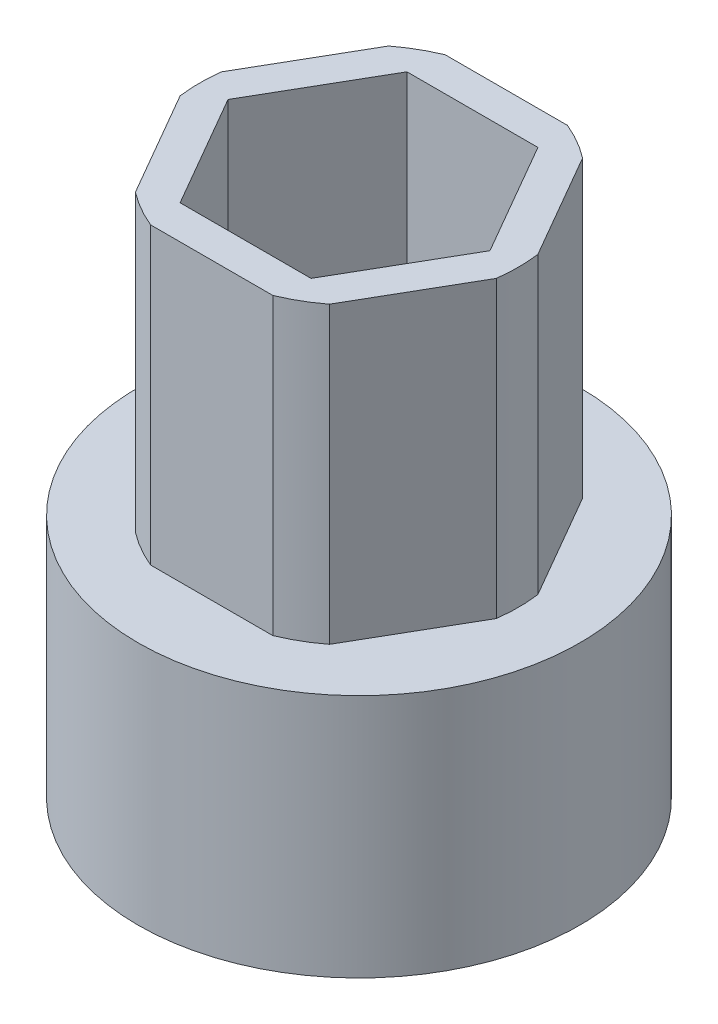
ISO-10303-21;
HEADER;
FILE_DESCRIPTION(('STEP AP214'),'2;1');
FILE_NAME('part.step','',(''),(''),'','','');
FILE_SCHEMA(('AUTOMOTIVE_DESIGN { 1 0 10303 214 1 1 1 1 }'));
ENDSEC;
DATA;
#1=APPLICATION_CONTEXT('core data for automotive mechanical design processes');
#2=APPLICATION_PROTOCOL_DEFINITION('international standard','automotive_design',2000,#1);
#3=PRODUCT_CONTEXT('',#1,'mechanical');
#4=PRODUCT('Part','Part','',(#3));
#5=PRODUCT_RELATED_PRODUCT_CATEGORY('part','',(#4));
#6=PRODUCT_DEFINITION_FORMATION('','',#4);
#7=PRODUCT_DEFINITION_CONTEXT('part definition',#1,'design');
#8=PRODUCT_DEFINITION('design','',#6,#7);
#9=PRODUCT_DEFINITION_SHAPE('','',#8);
#10=(LENGTH_UNIT() NAMED_UNIT(*) SI_UNIT(.MILLI.,.METRE.));
#11=(NAMED_UNIT(*) PLANE_ANGLE_UNIT() SI_UNIT($,.RADIAN.));
#12=(NAMED_UNIT(*) SI_UNIT($,.STERADIAN.) SOLID_ANGLE_UNIT());
#13=UNCERTAINTY_MEASURE_WITH_UNIT(LENGTH_MEASURE(1.E-05),#10,'distance_accuracy_value','');
#14=(GEOMETRIC_REPRESENTATION_CONTEXT(3) GLOBAL_UNCERTAINTY_ASSIGNED_CONTEXT((#13)) GLOBAL_UNIT_ASSIGNED_CONTEXT((#10,
#11,#12)) REPRESENTATION_CONTEXT('',''));
#15=CARTESIAN_POINT('',(0.,0.,0.));
#16=DIRECTION('',(0.,0.,1.));
#17=DIRECTION('',(1.,0.,0.));
#18=AXIS2_PLACEMENT_3D('',#15,#16,#17);
#19=CARTESIAN_POINT('',(0.,10.541,0.));
#20=DIRECTION('',(0.,1.,0.));
#21=DIRECTION('',(0.,0.,1.));
#22=AXIS2_PLACEMENT_3D('',#19,#20,#21);
#23=PLANE('',#22);
#24=CARTESIAN_POINT('',(0.,10.541,0.));
#25=DIRECTION('',(0.,1.,0.));
#26=DIRECTION('',(0.,0.,1.));
#27=AXIS2_PLACEMENT_3D('',#24,#25,#26);
#28=CIRCLE('',#27,6.875);
#29=CARTESIAN_POINT('',(6.81675182633099,10.541,0.893039494206789));
#30=VERTEX_POINT('',#29);
#31=CARTESIAN_POINT('',(6.81675182633099,10.541,-0.893039494206791));
#32=VERTEX_POINT('',#31);
#33=EDGE_CURVE('E233',#30,#32,#28,.T.);
#34=ORIENTED_EDGE('',*,*,#33,.F.);
#35=DIRECTION('',(0.5,0.,-0.866025403784439));
#36=VECTOR('',#35,1.);
#37=CARTESIAN_POINT('',(5.49926131403119,10.541,3.175));
#38=LINE('',#37,#36);
#39=CARTESIAN_POINT('',(4.18177080173138,10.541,5.45696050579321));
#40=VERTEX_POINT('',#39);
#41=EDGE_CURVE('E230',#40,#30,#38,.T.);
#42=ORIENTED_EDGE('',*,*,#41,.F.);
#43=CARTESIAN_POINT('',(0.,10.541,0.));
#44=DIRECTION('',(0.,1.,0.));
#45=DIRECTION('',(0.,0.,1.));
#46=AXIS2_PLACEMENT_3D('',#43,#44,#45);
#47=CIRCLE('',#46,6.875);
#48=CARTESIAN_POINT('',(2.6349810245996,10.541,6.35));
#49=VERTEX_POINT('',#48);
#50=EDGE_CURVE('E192',#49,#40,#47,.T.);
#51=ORIENTED_EDGE('',*,*,#50,.F.);
#52=DIRECTION('',(1.,0.,0.));
#53=VECTOR('',#52,1.);
#54=CARTESIAN_POINT('',(0.,10.541,6.35));
#55=LINE('',#54,#53);
#56=CARTESIAN_POINT('',(-2.6349810245996,10.541,6.35));
#57=VERTEX_POINT('',#56);
#58=EDGE_CURVE('E194',#57,#49,#55,.T.);
#59=ORIENTED_EDGE('',*,*,#58,.F.);
#60=CARTESIAN_POINT('',(0.,10.541,0.));
#61=DIRECTION('',(0.,1.,0.));
#62=DIRECTION('',(0.,0.,1.));
#63=AXIS2_PLACEMENT_3D('',#60,#61,#62);
#64=CIRCLE('',#63,6.875);
#65=CARTESIAN_POINT('',(-4.18177080173139,10.541,5.4569605057932));
#66=VERTEX_POINT('',#65);
#67=EDGE_CURVE('E249',#66,#57,#64,.T.);
#68=ORIENTED_EDGE('',*,*,#67,.F.);
#69=DIRECTION('',(0.500000000000001,0.,0.866025403784438));
#70=VECTOR('',#69,1.);
#71=CARTESIAN_POINT('',(-5.49926131403119,10.541,3.17500000000001));
#72=LINE('',#71,#70);
#73=CARTESIAN_POINT('',(-6.81675182633099,10.541,0.893039494206804));
#74=VERTEX_POINT('',#73);
#75=EDGE_CURVE('E247',#74,#66,#72,.T.);
#76=ORIENTED_EDGE('',*,*,#75,.F.);
#77=CARTESIAN_POINT('',(0.,10.541,0.));
#78=DIRECTION('',(0.,1.,0.));
#79=DIRECTION('',(0.,0.,1.));
#80=AXIS2_PLACEMENT_3D('',#77,#78,#79);
#81=CIRCLE('',#80,6.875);
#82=CARTESIAN_POINT('',(-6.81675182633099,10.541,-0.893039494206801));
#83=VERTEX_POINT('',#82);
#84=EDGE_CURVE('E245',#83,#74,#81,.T.);
#85=ORIENTED_EDGE('',*,*,#84,.F.);
#86=DIRECTION('',(-0.5,0.,0.866025403784439));
#87=VECTOR('',#86,1.);
#88=CARTESIAN_POINT('',(-5.49926131403119,10.541,-3.175));
#89=LINE('',#88,#87);
#90=CARTESIAN_POINT('',(-4.18177080173139,10.541,-5.4569605057932));
#91=VERTEX_POINT('',#90);
#92=EDGE_CURVE('E243',#91,#83,#89,.T.);
#93=ORIENTED_EDGE('',*,*,#92,.F.);
#94=CARTESIAN_POINT('',(0.,10.541,0.));
#95=DIRECTION('',(0.,1.,0.));
#96=DIRECTION('',(0.,0.,1.));
#97=AXIS2_PLACEMENT_3D('',#94,#95,#96);
#98=CIRCLE('',#97,6.875);
#99=CARTESIAN_POINT('',(-2.6349810245996,10.541,-6.35));
#100=VERTEX_POINT('',#99);
#101=EDGE_CURVE('E241',#100,#91,#98,.T.);
#102=ORIENTED_EDGE('',*,*,#101,.F.);
#103=DIRECTION('',(-1.,0.,0.));
#104=VECTOR('',#103,1.);
#105=CARTESIAN_POINT('',(0.,10.541,-6.35));
#106=LINE('',#105,#104);
#107=CARTESIAN_POINT('',(2.6349810245996,10.541,-6.35));
#108=VERTEX_POINT('',#107);
#109=EDGE_CURVE('E239',#108,#100,#106,.T.);
#110=ORIENTED_EDGE('',*,*,#109,.F.);
#111=CARTESIAN_POINT('',(0.,10.541,0.));
#112=DIRECTION('',(0.,1.,0.));
#113=DIRECTION('',(0.,0.,1.));
#114=AXIS2_PLACEMENT_3D('',#111,#112,#113);
#115=CIRCLE('',#114,6.875);
#116=CARTESIAN_POINT('',(4.18177080173138,10.541,-5.45696050579321));
#117=VERTEX_POINT('',#116);
#118=EDGE_CURVE('E237',#117,#108,#115,.T.);
#119=ORIENTED_EDGE('',*,*,#118,.F.);
#120=DIRECTION('',(-0.5,0.,-0.866025403784439));
#121=VECTOR('',#120,1.);
#122=CARTESIAN_POINT('',(5.49926131403118,10.541,-3.175));
#123=LINE('',#122,#121);
#124=EDGE_CURVE('E235',#32,#117,#123,.T.);
#125=ORIENTED_EDGE('',*,*,#124,.F.);
#126=EDGE_LOOP('',(#34,#42,#51,#59,#68,#76,#85,#93,#102,#110,#119,#125));
#127=FACE_BOUND('',#126,.T.);
#128=CARTESIAN_POINT('',(0.,10.541,0.));
#129=DIRECTION('',(0.,1.,0.));
#130=DIRECTION('',(0.,0.,1.));
#131=AXIS2_PLACEMENT_3D('',#128,#129,#130);
#132=CIRCLE('',#131,9.525);
#133=CARTESIAN_POINT('',(0.,10.541,9.525));
#134=VERTEX_POINT('',#133);
#135=EDGE_CURVE('E11',#134,#134,#132,.T.);
#136=ORIENTED_EDGE('',*,*,#135,.T.);
#137=EDGE_LOOP('',(#136));
#138=FACE_BOUND('',#137,.T.);
#139=ADVANCED_FACE('F39',(#127,#138),#23,.T.);
#140=CARTESIAN_POINT('',(0.,0.,0.));
#141=DIRECTION('',(0.,1.,0.));
#142=DIRECTION('',(0.,0.,1.));
#143=AXIS2_PLACEMENT_3D('',#140,#141,#142);
#144=PLANE('',#143);
#145=CARTESIAN_POINT('',(0.,0.,0.));
#146=DIRECTION('',(0.,1.,0.));
#147=DIRECTION('',(0.,0.,1.));
#148=AXIS2_PLACEMENT_3D('',#145,#146,#147);
#149=CIRCLE('',#148,9.525);
#150=CARTESIAN_POINT('',(0.,0.,9.525));
#151=VERTEX_POINT('',#150);
#152=EDGE_CURVE('E43',#151,#151,#149,.T.);
#153=ORIENTED_EDGE('',*,*,#152,.F.);
#154=EDGE_LOOP('',(#153));
#155=FACE_BOUND('',#154,.T.);
#156=DIRECTION('',(0.5,0.,-0.866025403784439));
#157=VECTOR('',#156,1.);
#158=CARTESIAN_POINT('',(2.82295414120267,0.,4.8895));
#159=LINE('',#158,#157);
#160=CARTESIAN_POINT('',(2.82295414120267,0.,4.8895));
#161=VERTEX_POINT('',#160);
#162=CARTESIAN_POINT('',(5.64590828240535,0.,0.));
#163=VERTEX_POINT('',#162);
#164=EDGE_CURVE('E62',#161,#163,#159,.T.);
#165=ORIENTED_EDGE('',*,*,#164,.T.);
#166=DIRECTION('',(-0.5,0.,-0.866025403784439));
#167=VECTOR('',#166,1.);
#168=CARTESIAN_POINT('',(5.64590828240535,0.,0.));
#169=LINE('',#168,#167);
#170=CARTESIAN_POINT('',(2.82295414120267,0.,-4.8895));
#171=VERTEX_POINT('',#170);
#172=EDGE_CURVE('E285',#163,#171,#169,.T.);
#173=ORIENTED_EDGE('',*,*,#172,.T.);
#174=DIRECTION('',(-1.,0.,0.));
#175=VECTOR('',#174,1.);
#176=CARTESIAN_POINT('',(2.82295414120267,0.,-4.8895));
#177=LINE('',#176,#175);
#178=CARTESIAN_POINT('',(-2.82295414120268,0.,-4.8895));
#179=VERTEX_POINT('',#178);
#180=EDGE_CURVE('E172',#171,#179,#177,.T.);
#181=ORIENTED_EDGE('',*,*,#180,.T.);
#182=DIRECTION('',(-0.5,0.,0.866025403784439));
#183=VECTOR('',#182,1.);
#184=CARTESIAN_POINT('',(-2.82295414120268,0.,-4.8895));
#185=LINE('',#184,#183);
#186=CARTESIAN_POINT('',(-5.64590828240535,0.,0.));
#187=VERTEX_POINT('',#186);
#188=EDGE_CURVE('E288',#179,#187,#185,.T.);
#189=ORIENTED_EDGE('',*,*,#188,.T.);
#190=DIRECTION('',(0.5,0.,0.866025403784439));
#191=VECTOR('',#190,1.);
#192=CARTESIAN_POINT('',(-5.64590828240535,0.,0.));
#193=LINE('',#192,#191);
#194=CARTESIAN_POINT('',(-2.82295414120268,0.,4.8895));
#195=VERTEX_POINT('',#194);
#196=EDGE_CURVE('E291',#187,#195,#193,.T.);
#197=ORIENTED_EDGE('',*,*,#196,.T.);
#198=DIRECTION('',(1.,0.,0.));
#199=VECTOR('',#198,1.);
#200=CARTESIAN_POINT('',(-2.82295414120268,0.,4.8895));
#201=LINE('',#200,#199);
#202=EDGE_CURVE('E294',#195,#161,#201,.T.);
#203=ORIENTED_EDGE('',*,*,#202,.T.);
#204=EDGE_LOOP('',(#165,#173,#181,#189,#197,#203));
#205=FACE_BOUND('',#204,.T.);
#206=ADVANCED_FACE('F308',(#155,#205),#144,.F.);
#207=CARTESIAN_POINT('',(0.,10.541,0.));
#208=DIRECTION('',(0.,-1.,0.));
#209=DIRECTION('',(0.,0.,-1.));
#210=AXIS2_PLACEMENT_3D('',#207,#208,#209);
#211=CYLINDRICAL_SURFACE('',#210,9.525);
#212=ORIENTED_EDGE('',*,*,#135,.F.);
#213=EDGE_LOOP('',(#212));
#214=FACE_BOUND('',#213,.T.);
#215=ORIENTED_EDGE('',*,*,#152,.T.);
#216=EDGE_LOOP('',(#215));
#217=FACE_BOUND('',#216,.T.);
#218=ADVANCED_FACE('F41',(#214,#217),#211,.T.);
#219=CARTESIAN_POINT('',(2.82295414120267,10.541,4.8895));
#220=DIRECTION('',(-0.866025403784439,0.,-0.5));
#221=DIRECTION('',(-0.5,0.,0.866025403784439));
#222=AXIS2_PLACEMENT_3D('',#219,#220,#221);
#223=PLANE('',#222);
#224=ORIENTED_EDGE('',*,*,#164,.F.);
#225=DIRECTION('',(0.,-1.,0.));
#226=VECTOR('',#225,1.);
#227=CARTESIAN_POINT('',(2.82295414120267,10.541,4.8895));
#228=LINE('',#227,#226);
#229=CARTESIAN_POINT('',(2.82295414120267,23.241,4.8895));
#230=VERTEX_POINT('',#229);
#231=EDGE_CURVE('E297',#230,#161,#228,.T.);
#232=ORIENTED_EDGE('',*,*,#231,.F.);
#233=DIRECTION('',(-0.5,0.,0.866025403784439));
#234=VECTOR('',#233,1.);
#235=CARTESIAN_POINT('',(4.23443121180401,23.241,2.44475));
#236=LINE('',#235,#234);
#237=CARTESIAN_POINT('',(5.64590828240535,23.241,0.));
#238=VERTEX_POINT('',#237);
#239=EDGE_CURVE('E184',#238,#230,#236,.T.);
#240=ORIENTED_EDGE('',*,*,#239,.F.);
#241=DIRECTION('',(0.,-1.,0.));
#242=VECTOR('',#241,1.);
#243=CARTESIAN_POINT('',(5.64590828240535,10.541,0.));
#244=LINE('',#243,#242);
#245=EDGE_CURVE('E175',#238,#163,#244,.T.);
#246=ORIENTED_EDGE('',*,*,#245,.T.);
#247=EDGE_LOOP('',(#224,#232,#240,#246));
#248=FACE_BOUND('',#247,.T.);
#249=ADVANCED_FACE('F316',(#248),#223,.T.);
#250=CARTESIAN_POINT('',(5.64590828240535,10.541,0.));
#251=DIRECTION('',(-0.866025403784439,0.,0.5));
#252=DIRECTION('',(0.5,0.,0.866025403784439));
#253=AXIS2_PLACEMENT_3D('',#250,#251,#252);
#254=PLANE('',#253);
#255=ORIENTED_EDGE('',*,*,#172,.F.);
#256=ORIENTED_EDGE('',*,*,#245,.F.);
#257=DIRECTION('',(0.5,0.,0.866025403784439));
#258=VECTOR('',#257,1.);
#259=CARTESIAN_POINT('',(4.23443121180401,23.241,-2.44475));
#260=LINE('',#259,#258);
#261=CARTESIAN_POINT('',(2.82295414120267,23.241,-4.8895));
#262=VERTEX_POINT('',#261);
#263=EDGE_CURVE('E179',#262,#238,#260,.T.);
#264=ORIENTED_EDGE('',*,*,#263,.F.);
#265=DIRECTION('',(0.,-1.,0.));
#266=VECTOR('',#265,1.);
#267=CARTESIAN_POINT('',(2.82295414120267,10.541,-4.8895));
#268=LINE('',#267,#266);
#269=EDGE_CURVE('E166',#262,#171,#268,.T.);
#270=ORIENTED_EDGE('',*,*,#269,.T.);
#271=EDGE_LOOP('',(#255,#256,#264,#270));
#272=FACE_BOUND('',#271,.T.);
#273=ADVANCED_FACE('F180',(#272),#254,.T.);
#274=CARTESIAN_POINT('',(2.82295414120267,10.541,-4.8895));
#275=DIRECTION('',(0.,0.,1.));
#276=DIRECTION('',(1.,0.,0.));
#277=AXIS2_PLACEMENT_3D('',#274,#275,#276);
#278=PLANE('',#277);
#279=ORIENTED_EDGE('',*,*,#180,.F.);
#280=ORIENTED_EDGE('',*,*,#269,.F.);
#281=DIRECTION('',(1.,0.,0.));
#282=VECTOR('',#281,1.);
#283=CARTESIAN_POINT('',(0.,23.241,-4.8895));
#284=LINE('',#283,#282);
#285=CARTESIAN_POINT('',(-2.82295414120268,23.241,-4.8895));
#286=VERTEX_POINT('',#285);
#287=EDGE_CURVE('E170',#286,#262,#284,.T.);
#288=ORIENTED_EDGE('',*,*,#287,.F.);
#289=DIRECTION('',(0.,-1.,0.));
#290=VECTOR('',#289,1.);
#291=CARTESIAN_POINT('',(-2.82295414120268,10.541,-4.8895));
#292=LINE('',#291,#290);
#293=EDGE_CURVE('E176',#286,#179,#292,.T.);
#294=ORIENTED_EDGE('',*,*,#293,.T.);
#295=EDGE_LOOP('',(#279,#280,#288,#294));
#296=FACE_BOUND('',#295,.T.);
#297=ADVANCED_FACE('F168',(#296),#278,.T.);
#298=CARTESIAN_POINT('',(-2.82295414120268,10.541,-4.8895));
#299=DIRECTION('',(0.866025403784439,0.,0.5));
#300=DIRECTION('',(0.5,0.,-0.866025403784439));
#301=AXIS2_PLACEMENT_3D('',#298,#299,#300);
#302=PLANE('',#301);
#303=ORIENTED_EDGE('',*,*,#188,.F.);
#304=ORIENTED_EDGE('',*,*,#293,.F.);
#305=DIRECTION('',(0.5,0.,-0.866025403784439));
#306=VECTOR('',#305,1.);
#307=CARTESIAN_POINT('',(-4.23443121180402,23.241,-2.44475));
#308=LINE('',#307,#306);
#309=CARTESIAN_POINT('',(-5.64590828240535,23.241,0.));
#310=VERTEX_POINT('',#309);
#311=EDGE_CURVE('E191',#310,#286,#308,.T.);
#312=ORIENTED_EDGE('',*,*,#311,.F.);
#313=DIRECTION('',(0.,-1.,0.));
#314=VECTOR('',#313,1.);
#315=CARTESIAN_POINT('',(-5.64590828240535,10.541,0.));
#316=LINE('',#315,#314);
#317=EDGE_CURVE('E301',#310,#187,#316,.T.);
#318=ORIENTED_EDGE('',*,*,#317,.T.);
#319=EDGE_LOOP('',(#303,#304,#312,#318));
#320=FACE_BOUND('',#319,.T.);
#321=ADVANCED_FACE('F322',(#320),#302,.T.);
#322=CARTESIAN_POINT('',(-5.64590828240535,10.541,0.));
#323=DIRECTION('',(0.866025403784439,0.,-0.5));
#324=DIRECTION('',(-0.5,0.,-0.866025403784439));
#325=AXIS2_PLACEMENT_3D('',#322,#323,#324);
#326=PLANE('',#325);
#327=ORIENTED_EDGE('',*,*,#196,.F.);
#328=ORIENTED_EDGE('',*,*,#317,.F.);
#329=DIRECTION('',(-0.5,0.,-0.866025403784439));
#330=VECTOR('',#329,1.);
#331=CARTESIAN_POINT('',(-4.23443121180402,23.241,2.44475));
#332=LINE('',#331,#330);
#333=CARTESIAN_POINT('',(-2.82295414120268,23.241,4.8895));
#334=VERTEX_POINT('',#333);
#335=EDGE_CURVE('E201',#334,#310,#332,.T.);
#336=ORIENTED_EDGE('',*,*,#335,.F.);
#337=DIRECTION('',(0.,-1.,0.));
#338=VECTOR('',#337,1.);
#339=CARTESIAN_POINT('',(-2.82295414120268,10.541,4.8895));
#340=LINE('',#339,#338);
#341=EDGE_CURVE('E299',#334,#195,#340,.T.);
#342=ORIENTED_EDGE('',*,*,#341,.T.);
#343=EDGE_LOOP('',(#327,#328,#336,#342));
#344=FACE_BOUND('',#343,.T.);
#345=ADVANCED_FACE('F319',(#344),#326,.T.);
#346=CARTESIAN_POINT('',(-2.82295414120268,10.541,4.8895));
#347=DIRECTION('',(0.,0.,-1.));
#348=DIRECTION('',(-1.,0.,0.));
#349=AXIS2_PLACEMENT_3D('',#346,#347,#348);
#350=PLANE('',#349);
#351=ORIENTED_EDGE('',*,*,#202,.F.);
#352=ORIENTED_EDGE('',*,*,#341,.F.);
#353=DIRECTION('',(-1.,0.,0.));
#354=VECTOR('',#353,1.);
#355=CARTESIAN_POINT('',(0.,23.241,4.8895));
#356=LINE('',#355,#354);
#357=EDGE_CURVE('E198',#230,#334,#356,.T.);
#358=ORIENTED_EDGE('',*,*,#357,.F.);
#359=ORIENTED_EDGE('',*,*,#231,.T.);
#360=EDGE_LOOP('',(#351,#352,#358,#359));
#361=FACE_BOUND('',#360,.T.);
#362=ADVANCED_FACE('F314',(#361),#350,.T.);
#363=CARTESIAN_POINT('',(5.49926131403119,23.241,3.175));
#364=DIRECTION('',(-0.866025403784439,0.,-0.5));
#365=DIRECTION('',(-0.5,0.,0.866025403784439));
#366=AXIS2_PLACEMENT_3D('',#363,#364,#365);
#367=PLANE('',#366);
#368=ORIENTED_EDGE('',*,*,#41,.T.);
#369=DIRECTION('',(0.,-1.,0.));
#370=VECTOR('',#369,1.);
#371=CARTESIAN_POINT('',(6.81675182633099,23.241,0.893039494206789));
#372=LINE('',#371,#370);
#373=CARTESIAN_POINT('',(6.81675182633099,23.241,0.893039494206789));
#374=VERTEX_POINT('',#373);
#375=EDGE_CURVE('E282',#374,#30,#372,.T.);
#376=ORIENTED_EDGE('',*,*,#375,.F.);
#377=DIRECTION('',(0.5,0.,-0.866025403784439));
#378=VECTOR('',#377,1.);
#379=CARTESIAN_POINT('',(5.49926131403119,23.241,3.175));
#380=LINE('',#379,#378);
#381=CARTESIAN_POINT('',(4.18177080173138,23.241,5.45696050579321));
#382=VERTEX_POINT('',#381);
#383=EDGE_CURVE('E204',#382,#374,#380,.T.);
#384=ORIENTED_EDGE('',*,*,#383,.F.);
#385=DIRECTION('',(0.,-1.,0.));
#386=VECTOR('',#385,1.);
#387=CARTESIAN_POINT('',(4.18177080173138,23.241,5.45696050579321));
#388=LINE('',#387,#386);
#389=EDGE_CURVE('E229',#382,#40,#388,.T.);
#390=ORIENTED_EDGE('',*,*,#389,.T.);
#391=EDGE_LOOP('',(#368,#376,#384,#390));
#392=FACE_BOUND('',#391,.T.);
#393=ADVANCED_FACE('F373',(#392),#367,.F.);
#394=CARTESIAN_POINT('',(0.,23.241,0.));
#395=DIRECTION('',(0.,-1.,0.));
#396=DIRECTION('',(0.,0.,-1.));
#397=AXIS2_PLACEMENT_3D('',#394,#395,#396);
#398=CYLINDRICAL_SURFACE('',#397,6.875);
#399=ORIENTED_EDGE('',*,*,#33,.T.);
#400=DIRECTION('',(0.,-1.,0.));
#401=VECTOR('',#400,1.);
#402=CARTESIAN_POINT('',(6.81675182633099,23.241,-0.893039494206791));
#403=LINE('',#402,#401);
#404=CARTESIAN_POINT('',(6.81675182633099,23.241,-0.893039494206791));
#405=VERTEX_POINT('',#404);
#406=EDGE_CURVE('E279',#405,#32,#403,.T.);
#407=ORIENTED_EDGE('',*,*,#406,.F.);
#408=CARTESIAN_POINT('',(0.,23.241,0.));
#409=DIRECTION('',(0.,1.,0.));
#410=DIRECTION('',(0.,0.,1.));
#411=AXIS2_PLACEMENT_3D('',#408,#409,#410);
#412=CIRCLE('',#411,6.875);
#413=EDGE_CURVE('E207',#374,#405,#412,.T.);
#414=ORIENTED_EDGE('',*,*,#413,.F.);
#415=ORIENTED_EDGE('',*,*,#375,.T.);
#416=EDGE_LOOP('',(#399,#407,#414,#415));
#417=FACE_BOUND('',#416,.T.);
#418=ADVANCED_FACE('F383',(#417),#398,.T.);
#419=CARTESIAN_POINT('',(5.49926131403118,23.241,-3.175));
#420=DIRECTION('',(-0.866025403784439,0.,0.5));
#421=DIRECTION('',(0.5,0.,0.866025403784439));
#422=AXIS2_PLACEMENT_3D('',#419,#420,#421);
#423=PLANE('',#422);
#424=ORIENTED_EDGE('',*,*,#124,.T.);
#425=DIRECTION('',(0.,-1.,0.));
#426=VECTOR('',#425,1.);
#427=CARTESIAN_POINT('',(4.18177080173138,23.241,-5.45696050579321));
#428=LINE('',#427,#426);
#429=CARTESIAN_POINT('',(4.18177080173138,23.241,-5.45696050579321));
#430=VERTEX_POINT('',#429);
#431=EDGE_CURVE('E276',#430,#117,#428,.T.);
#432=ORIENTED_EDGE('',*,*,#431,.F.);
#433=DIRECTION('',(-0.5,0.,-0.866025403784439));
#434=VECTOR('',#433,1.);
#435=CARTESIAN_POINT('',(5.49926131403118,23.241,-3.175));
#436=LINE('',#435,#434);
#437=EDGE_CURVE('E209',#405,#430,#436,.T.);
#438=ORIENTED_EDGE('',*,*,#437,.F.);
#439=ORIENTED_EDGE('',*,*,#406,.T.);
#440=EDGE_LOOP('',(#424,#432,#438,#439));
#441=FACE_BOUND('',#440,.T.);
#442=ADVANCED_FACE('F394',(#441),#423,.F.);
#443=CARTESIAN_POINT('',(0.,23.241,0.));
#444=DIRECTION('',(0.,-1.,0.));
#445=DIRECTION('',(0.,0.,-1.));
#446=AXIS2_PLACEMENT_3D('',#443,#444,#445);
#447=CYLINDRICAL_SURFACE('',#446,6.875);
#448=ORIENTED_EDGE('',*,*,#118,.T.);
#449=DIRECTION('',(0.,-1.,0.));
#450=VECTOR('',#449,1.);
#451=CARTESIAN_POINT('',(2.6349810245996,23.241,-6.35));
#452=LINE('',#451,#450);
#453=CARTESIAN_POINT('',(2.6349810245996,23.241,-6.35));
#454=VERTEX_POINT('',#453);
#455=EDGE_CURVE('E273',#454,#108,#452,.T.);
#456=ORIENTED_EDGE('',*,*,#455,.F.);
#457=CARTESIAN_POINT('',(0.,23.241,0.));
#458=DIRECTION('',(0.,1.,0.));
#459=DIRECTION('',(0.,0.,1.));
#460=AXIS2_PLACEMENT_3D('',#457,#458,#459);
#461=CIRCLE('',#460,6.875);
#462=EDGE_CURVE('E211',#430,#454,#461,.T.);
#463=ORIENTED_EDGE('',*,*,#462,.F.);
#464=ORIENTED_EDGE('',*,*,#431,.T.);
#465=EDGE_LOOP('',(#448,#456,#463,#464));
#466=FACE_BOUND('',#465,.T.);
#467=ADVANCED_FACE('F405',(#466),#447,.T.);
#468=CARTESIAN_POINT('',(0.,23.241,-6.35));
#469=DIRECTION('',(0.,0.,1.));
#470=DIRECTION('',(1.,0.,0.));
#471=AXIS2_PLACEMENT_3D('',#468,#469,#470);
#472=PLANE('',#471);
#473=ORIENTED_EDGE('',*,*,#109,.T.);
#474=DIRECTION('',(0.,-1.,0.));
#475=VECTOR('',#474,1.);
#476=CARTESIAN_POINT('',(-2.6349810245996,23.241,-6.35));
#477=LINE('',#476,#475);
#478=CARTESIAN_POINT('',(-2.6349810245996,23.241,-6.35));
#479=VERTEX_POINT('',#478);
#480=EDGE_CURVE('E270',#479,#100,#477,.T.);
#481=ORIENTED_EDGE('',*,*,#480,.F.);
#482=DIRECTION('',(-1.,0.,0.));
#483=VECTOR('',#482,1.);
#484=CARTESIAN_POINT('',(0.,23.241,-6.35));
#485=LINE('',#484,#483);
#486=EDGE_CURVE('E213',#454,#479,#485,.T.);
#487=ORIENTED_EDGE('',*,*,#486,.F.);
#488=ORIENTED_EDGE('',*,*,#455,.T.);
#489=EDGE_LOOP('',(#473,#481,#487,#488));
#490=FACE_BOUND('',#489,.T.);
#491=ADVANCED_FACE('F416',(#490),#472,.F.);
#492=CARTESIAN_POINT('',(0.,23.241,0.));
#493=DIRECTION('',(0.,-1.,0.));
#494=DIRECTION('',(0.,0.,-1.));
#495=AXIS2_PLACEMENT_3D('',#492,#493,#494);
#496=CYLINDRICAL_SURFACE('',#495,6.875);
#497=ORIENTED_EDGE('',*,*,#101,.T.);
#498=DIRECTION('',(0.,-1.,0.));
#499=VECTOR('',#498,1.);
#500=CARTESIAN_POINT('',(-4.18177080173139,23.241,-5.4569605057932));
#501=LINE('',#500,#499);
#502=CARTESIAN_POINT('',(-4.18177080173139,23.241,-5.4569605057932));
#503=VERTEX_POINT('',#502);
#504=EDGE_CURVE('E267',#503,#91,#501,.T.);
#505=ORIENTED_EDGE('',*,*,#504,.F.);
#506=CARTESIAN_POINT('',(0.,23.241,0.));
#507=DIRECTION('',(0.,1.,0.));
#508=DIRECTION('',(0.,0.,1.));
#509=AXIS2_PLACEMENT_3D('',#506,#507,#508);
#510=CIRCLE('',#509,6.875);
#511=EDGE_CURVE('E215',#479,#503,#510,.T.);
#512=ORIENTED_EDGE('',*,*,#511,.F.);
#513=ORIENTED_EDGE('',*,*,#480,.T.);
#514=EDGE_LOOP('',(#497,#505,#512,#513));
#515=FACE_BOUND('',#514,.T.);
#516=ADVANCED_FACE('F427',(#515),#496,.T.);
#517=CARTESIAN_POINT('',(-5.49926131403119,23.241,-3.175));
#518=DIRECTION('',(0.866025403784439,0.,0.5));
#519=DIRECTION('',(0.5,0.,-0.866025403784439));
#520=AXIS2_PLACEMENT_3D('',#517,#518,#519);
#521=PLANE('',#520);
#522=ORIENTED_EDGE('',*,*,#92,.T.);
#523=DIRECTION('',(0.,-1.,0.));
#524=VECTOR('',#523,1.);
#525=CARTESIAN_POINT('',(-6.81675182633099,23.241,-0.893039494206801));
#526=LINE('',#525,#524);
#527=CARTESIAN_POINT('',(-6.81675182633099,23.241,-0.893039494206801));
#528=VERTEX_POINT('',#527);
#529=EDGE_CURVE('E264',#528,#83,#526,.T.);
#530=ORIENTED_EDGE('',*,*,#529,.F.);
#531=DIRECTION('',(-0.5,0.,0.866025403784439));
#532=VECTOR('',#531,1.);
#533=CARTESIAN_POINT('',(-5.49926131403119,23.241,-3.175));
#534=LINE('',#533,#532);
#535=EDGE_CURVE('E217',#503,#528,#534,.T.);
#536=ORIENTED_EDGE('',*,*,#535,.F.);
#537=ORIENTED_EDGE('',*,*,#504,.T.);
#538=EDGE_LOOP('',(#522,#530,#536,#537));
#539=FACE_BOUND('',#538,.T.);
#540=ADVANCED_FACE('F438',(#539),#521,.F.);
#541=CARTESIAN_POINT('',(0.,23.241,0.));
#542=DIRECTION('',(0.,-1.,0.));
#543=DIRECTION('',(0.,0.,-1.));
#544=AXIS2_PLACEMENT_3D('',#541,#542,#543);
#545=CYLINDRICAL_SURFACE('',#544,6.875);
#546=ORIENTED_EDGE('',*,*,#84,.T.);
#547=DIRECTION('',(0.,-1.,0.));
#548=VECTOR('',#547,1.);
#549=CARTESIAN_POINT('',(-6.81675182633099,23.241,0.893039494206804));
#550=LINE('',#549,#548);
#551=CARTESIAN_POINT('',(-6.81675182633099,23.241,0.893039494206804));
#552=VERTEX_POINT('',#551);
#553=EDGE_CURVE('E261',#552,#74,#550,.T.);
#554=ORIENTED_EDGE('',*,*,#553,.F.);
#555=CARTESIAN_POINT('',(0.,23.241,0.));
#556=DIRECTION('',(0.,1.,0.));
#557=DIRECTION('',(0.,0.,1.));
#558=AXIS2_PLACEMENT_3D('',#555,#556,#557);
#559=CIRCLE('',#558,6.875);
#560=EDGE_CURVE('E219',#528,#552,#559,.T.);
#561=ORIENTED_EDGE('',*,*,#560,.F.);
#562=ORIENTED_EDGE('',*,*,#529,.T.);
#563=EDGE_LOOP('',(#546,#554,#561,#562));
#564=FACE_BOUND('',#563,.T.);
#565=ADVANCED_FACE('F449',(#564),#545,.T.);
#566=CARTESIAN_POINT('',(-5.49926131403119,23.241,3.17500000000001));
#567=DIRECTION('',(0.866025403784438,0.,-0.500000000000001));
#568=DIRECTION('',(-0.500000000000001,0.,-0.866025403784438));
#569=AXIS2_PLACEMENT_3D('',#566,#567,#568);
#570=PLANE('',#569);
#571=ORIENTED_EDGE('',*,*,#75,.T.);
#572=DIRECTION('',(0.,-1.,0.));
#573=VECTOR('',#572,1.);
#574=CARTESIAN_POINT('',(-4.18177080173139,23.241,5.4569605057932));
#575=LINE('',#574,#573);
#576=CARTESIAN_POINT('',(-4.18177080173139,23.241,5.4569605057932));
#577=VERTEX_POINT('',#576);
#578=EDGE_CURVE('E258',#577,#66,#575,.T.);
#579=ORIENTED_EDGE('',*,*,#578,.F.);
#580=DIRECTION('',(0.500000000000001,0.,0.866025403784438));
#581=VECTOR('',#580,1.);
#582=CARTESIAN_POINT('',(-5.49926131403119,23.241,3.17500000000001));
#583=LINE('',#582,#581);
#584=EDGE_CURVE('E221',#552,#577,#583,.T.);
#585=ORIENTED_EDGE('',*,*,#584,.F.);
#586=ORIENTED_EDGE('',*,*,#553,.T.);
#587=EDGE_LOOP('',(#571,#579,#585,#586));
#588=FACE_BOUND('',#587,.T.);
#589=ADVANCED_FACE('F460',(#588),#570,.F.);
#590=CARTESIAN_POINT('',(0.,23.241,0.));
#591=DIRECTION('',(0.,-1.,0.));
#592=DIRECTION('',(0.,0.,-1.));
#593=AXIS2_PLACEMENT_3D('',#590,#591,#592);
#594=CYLINDRICAL_SURFACE('',#593,6.875);
#595=ORIENTED_EDGE('',*,*,#67,.T.);
#596=DIRECTION('',(0.,-1.,0.));
#597=VECTOR('',#596,1.);
#598=CARTESIAN_POINT('',(-2.6349810245996,23.241,6.35));
#599=LINE('',#598,#597);
#600=CARTESIAN_POINT('',(-2.6349810245996,23.241,6.35));
#601=VERTEX_POINT('',#600);
#602=EDGE_CURVE('E255',#601,#57,#599,.T.);
#603=ORIENTED_EDGE('',*,*,#602,.F.);
#604=CARTESIAN_POINT('',(0.,23.241,0.));
#605=DIRECTION('',(0.,1.,0.));
#606=DIRECTION('',(0.,0.,1.));
#607=AXIS2_PLACEMENT_3D('',#604,#605,#606);
#608=CIRCLE('',#607,6.875);
#609=EDGE_CURVE('E223',#577,#601,#608,.T.);
#610=ORIENTED_EDGE('',*,*,#609,.F.);
#611=ORIENTED_EDGE('',*,*,#578,.T.);
#612=EDGE_LOOP('',(#595,#603,#610,#611));
#613=FACE_BOUND('',#612,.T.);
#614=ADVANCED_FACE('F471',(#613),#594,.T.);
#615=CARTESIAN_POINT('',(0.,23.241,6.35));
#616=DIRECTION('',(0.,0.,-1.));
#617=DIRECTION('',(-1.,0.,0.));
#618=AXIS2_PLACEMENT_3D('',#615,#616,#617);
#619=PLANE('',#618);
#620=ORIENTED_EDGE('',*,*,#58,.T.);
#621=DIRECTION('',(0.,-1.,0.));
#622=VECTOR('',#621,1.);
#623=CARTESIAN_POINT('',(2.6349810245996,23.241,6.35));
#624=LINE('',#623,#622);
#625=CARTESIAN_POINT('',(2.6349810245996,23.241,6.35));
#626=VERTEX_POINT('',#625);
#627=EDGE_CURVE('E54',#626,#49,#624,.T.);
#628=ORIENTED_EDGE('',*,*,#627,.F.);
#629=DIRECTION('',(1.,0.,0.));
#630=VECTOR('',#629,1.);
#631=CARTESIAN_POINT('',(0.,23.241,6.35));
#632=LINE('',#631,#630);
#633=EDGE_CURVE('E225',#601,#626,#632,.T.);
#634=ORIENTED_EDGE('',*,*,#633,.F.);
#635=ORIENTED_EDGE('',*,*,#602,.T.);
#636=EDGE_LOOP('',(#620,#628,#634,#635));
#637=FACE_BOUND('',#636,.T.);
#638=ADVANCED_FACE('F482',(#637),#619,.F.);
#639=CARTESIAN_POINT('',(0.,23.241,0.));
#640=DIRECTION('',(0.,-1.,0.));
#641=DIRECTION('',(0.,0.,-1.));
#642=AXIS2_PLACEMENT_3D('',#639,#640,#641);
#643=CYLINDRICAL_SURFACE('',#642,6.875);
#644=ORIENTED_EDGE('',*,*,#50,.T.);
#645=ORIENTED_EDGE('',*,*,#389,.F.);
#646=CARTESIAN_POINT('',(0.,23.241,0.));
#647=DIRECTION('',(0.,1.,0.));
#648=DIRECTION('',(0.,0.,1.));
#649=AXIS2_PLACEMENT_3D('',#646,#647,#648);
#650=CIRCLE('',#649,6.875);
#651=EDGE_CURVE('E227',#626,#382,#650,.T.);
#652=ORIENTED_EDGE('',*,*,#651,.F.);
#653=ORIENTED_EDGE('',*,*,#627,.T.);
#654=EDGE_LOOP('',(#644,#645,#652,#653));
#655=FACE_BOUND('',#654,.T.);
#656=ADVANCED_FACE('F493',(#655),#643,.T.);
#657=CARTESIAN_POINT('',(0.,23.241,0.));
#658=DIRECTION('',(0.,1.,0.));
#659=DIRECTION('',(0.,0.,1.));
#660=AXIS2_PLACEMENT_3D('',#657,#658,#659);
#661=PLANE('',#660);
#662=ORIENTED_EDGE('',*,*,#287,.T.);
#663=ORIENTED_EDGE('',*,*,#263,.T.);
#664=ORIENTED_EDGE('',*,*,#239,.T.);
#665=ORIENTED_EDGE('',*,*,#357,.T.);
#666=ORIENTED_EDGE('',*,*,#335,.T.);
#667=ORIENTED_EDGE('',*,*,#311,.T.);
#668=EDGE_LOOP('',(#662,#663,#664,#665,#666,#667));
#669=FACE_BOUND('',#668,.T.);
#670=ORIENTED_EDGE('',*,*,#383,.T.);
#671=ORIENTED_EDGE('',*,*,#413,.T.);
#672=ORIENTED_EDGE('',*,*,#437,.T.);
#673=ORIENTED_EDGE('',*,*,#462,.T.);
#674=ORIENTED_EDGE('',*,*,#486,.T.);
#675=ORIENTED_EDGE('',*,*,#511,.T.);
#676=ORIENTED_EDGE('',*,*,#535,.T.);
#677=ORIENTED_EDGE('',*,*,#560,.T.);
#678=ORIENTED_EDGE('',*,*,#584,.T.);
#679=ORIENTED_EDGE('',*,*,#609,.T.);
#680=ORIENTED_EDGE('',*,*,#633,.T.);
#681=ORIENTED_EDGE('',*,*,#651,.T.);
#682=EDGE_LOOP('',(#670,#671,#672,#673,#674,#675,#676,#677,#678,#679,#680,#681));
#683=FACE_BOUND('',#682,.T.);
#684=ADVANCED_FACE('F187',(#669,#683),#661,.T.);
#685=CLOSED_SHELL('',(#139,#206,#218,#249,#273,#297,#321,#345,#362,#393,#418,#442,#467,#491,
#516,#540,#565,#589,#614,#638,#656,#684));
#686=MANIFOLD_SOLID_BREP('B2',#685);
#687=ADVANCED_BREP_SHAPE_REPRESENTATION('',(#18,#686),#14);
#688=SHAPE_DEFINITION_REPRESENTATION(#9,#687);
ENDSEC;
END-ISO-10303-21;
